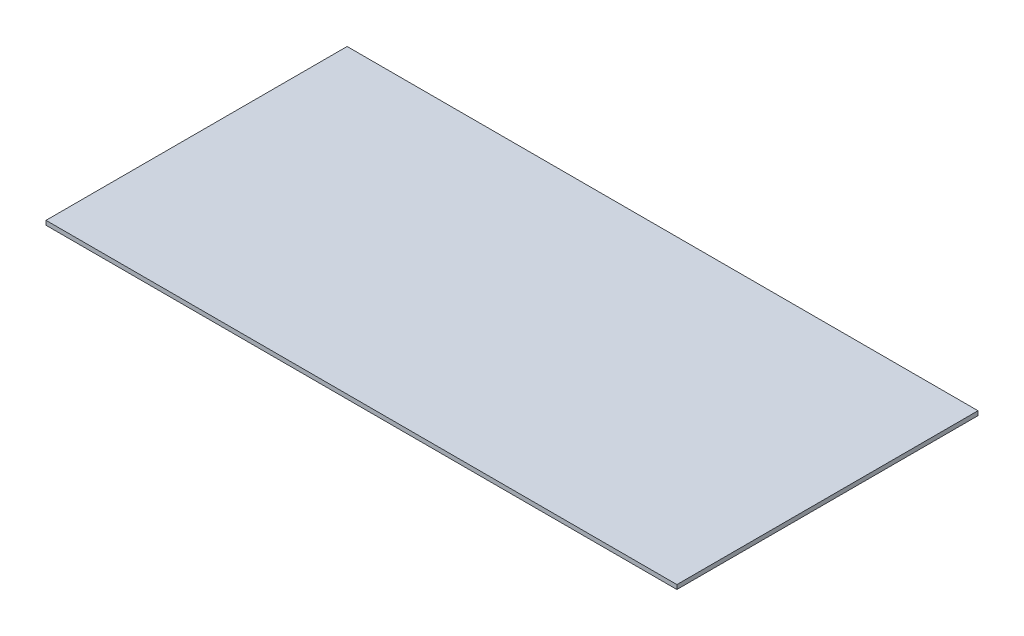
ISO-10303-21;
HEADER;
FILE_DESCRIPTION(('STEP AP214'),'2;1');
FILE_NAME('part.step','',(''),(''),'','','');
FILE_SCHEMA(('AUTOMOTIVE_DESIGN { 1 0 10303 214 1 1 1 1 }'));
ENDSEC;
DATA;
#1=APPLICATION_CONTEXT('core data for automotive mechanical design processes');
#2=APPLICATION_PROTOCOL_DEFINITION('international standard','automotive_design',2000,#1);
#3=PRODUCT_CONTEXT('',#1,'mechanical');
#4=PRODUCT('Part','Part','',(#3));
#5=PRODUCT_RELATED_PRODUCT_CATEGORY('part','',(#4));
#6=PRODUCT_DEFINITION_FORMATION('','',#4);
#7=PRODUCT_DEFINITION_CONTEXT('part definition',#1,'design');
#8=PRODUCT_DEFINITION('design','',#6,#7);
#9=PRODUCT_DEFINITION_SHAPE('','',#8);
#10=(LENGTH_UNIT() NAMED_UNIT(*) SI_UNIT(.MILLI.,.METRE.));
#11=(NAMED_UNIT(*) PLANE_ANGLE_UNIT() SI_UNIT($,.RADIAN.));
#12=(NAMED_UNIT(*) SI_UNIT($,.STERADIAN.) SOLID_ANGLE_UNIT());
#13=UNCERTAINTY_MEASURE_WITH_UNIT(LENGTH_MEASURE(1.E-05),#10,'distance_accuracy_value','');
#14=(GEOMETRIC_REPRESENTATION_CONTEXT(3) GLOBAL_UNCERTAINTY_ASSIGNED_CONTEXT((#13)) GLOBAL_UNIT_ASSIGNED_CONTEXT((#10,
#11,#12)) REPRESENTATION_CONTEXT('',''));
#15=CARTESIAN_POINT('',(0.,0.,0.));
#16=DIRECTION('',(0.,0.,1.));
#17=DIRECTION('',(1.,0.,0.));
#18=AXIS2_PLACEMENT_3D('',#15,#16,#17);
#19=CARTESIAN_POINT('',(0.,6.,0.));
#20=DIRECTION('',(1.,0.,0.));
#21=DIRECTION('',(0.,0.,-1.));
#22=AXIS2_PLACEMENT_3D('',#19,#20,#21);
#23=PLANE('',#22);
#24=DIRECTION('',(0.,0.,1.));
#25=VECTOR('',#24,1.);
#26=CARTESIAN_POINT('',(0.,0.,0.));
#27=LINE('',#26,#25);
#28=CARTESIAN_POINT('',(0.,0.,-420.));
#29=VERTEX_POINT('',#28);
#30=CARTESIAN_POINT('',(0.,0.,0.));
#31=VERTEX_POINT('',#30);
#32=EDGE_CURVE('E96',#29,#31,#27,.T.);
#33=ORIENTED_EDGE('',*,*,#32,.T.);
#34=DIRECTION('',(0.,-1.,0.));
#35=VECTOR('',#34,1.);
#36=CARTESIAN_POINT('',(0.,6.,0.));
#37=LINE('',#36,#35);
#38=CARTESIAN_POINT('',(0.,6.,0.));
#39=VERTEX_POINT('',#38);
#40=EDGE_CURVE('E11',#39,#31,#37,.T.);
#41=ORIENTED_EDGE('',*,*,#40,.F.);
#42=DIRECTION('',(0.,0.,1.));
#43=VECTOR('',#42,1.);
#44=CARTESIAN_POINT('',(0.,6.,0.));
#45=LINE('',#44,#43);
#46=CARTESIAN_POINT('',(0.,6.,-420.));
#47=VERTEX_POINT('',#46);
#48=EDGE_CURVE('E84',#47,#39,#45,.T.);
#49=ORIENTED_EDGE('',*,*,#48,.F.);
#50=DIRECTION('',(0.,-1.,0.));
#51=VECTOR('',#50,1.);
#52=CARTESIAN_POINT('',(0.,6.,-420.));
#53=LINE('',#52,#51);
#54=EDGE_CURVE('E92',#47,#29,#53,.T.);
#55=ORIENTED_EDGE('',*,*,#54,.T.);
#56=EDGE_LOOP('',(#33,#41,#49,#55));
#57=FACE_BOUND('',#56,.T.);
#58=ADVANCED_FACE('F33',(#57),#23,.F.);
#59=CARTESIAN_POINT('',(0.,6.,0.));
#60=DIRECTION('',(0.,0.,-1.));
#61=DIRECTION('',(-1.,0.,0.));
#62=AXIS2_PLACEMENT_3D('',#59,#60,#61);
#63=PLANE('',#62);
#64=DIRECTION('',(1.,0.,0.));
#65=VECTOR('',#64,1.);
#66=CARTESIAN_POINT('',(0.,0.,0.));
#67=LINE('',#66,#65);
#68=CARTESIAN_POINT('',(880.,0.,0.));
#69=VERTEX_POINT('',#68);
#70=EDGE_CURVE('E88',#31,#69,#67,.T.);
#71=ORIENTED_EDGE('',*,*,#70,.T.);
#72=DIRECTION('',(0.,-1.,0.));
#73=VECTOR('',#72,1.);
#74=CARTESIAN_POINT('',(880.,6.,0.));
#75=LINE('',#74,#73);
#76=CARTESIAN_POINT('',(880.,6.,0.));
#77=VERTEX_POINT('',#76);
#78=EDGE_CURVE('E41',#77,#69,#75,.T.);
#79=ORIENTED_EDGE('',*,*,#78,.F.);
#80=DIRECTION('',(1.,0.,0.));
#81=VECTOR('',#80,1.);
#82=CARTESIAN_POINT('',(0.,6.,0.));
#83=LINE('',#82,#81);
#84=EDGE_CURVE('E79',#39,#77,#83,.T.);
#85=ORIENTED_EDGE('',*,*,#84,.F.);
#86=ORIENTED_EDGE('',*,*,#40,.T.);
#87=EDGE_LOOP('',(#71,#79,#85,#86));
#88=FACE_BOUND('',#87,.T.);
#89=ADVANCED_FACE('F87',(#88),#63,.F.);
#90=CARTESIAN_POINT('',(880.,6.,0.));
#91=DIRECTION('',(-1.,0.,0.));
#92=DIRECTION('',(0.,0.,1.));
#93=AXIS2_PLACEMENT_3D('',#90,#91,#92);
#94=PLANE('',#93);
#95=DIRECTION('',(0.,0.,-1.));
#96=VECTOR('',#95,1.);
#97=CARTESIAN_POINT('',(880.,0.,0.));
#98=LINE('',#97,#96);
#99=CARTESIAN_POINT('',(880.,0.,-420.));
#100=VERTEX_POINT('',#99);
#101=EDGE_CURVE('E66',#69,#100,#98,.T.);
#102=ORIENTED_EDGE('',*,*,#101,.T.);
#103=DIRECTION('',(0.,-1.,0.));
#104=VECTOR('',#103,1.);
#105=CARTESIAN_POINT('',(880.,6.,-420.));
#106=LINE('',#105,#104);
#107=CARTESIAN_POINT('',(880.,6.,-420.));
#108=VERTEX_POINT('',#107);
#109=EDGE_CURVE('E89',#108,#100,#106,.T.);
#110=ORIENTED_EDGE('',*,*,#109,.F.);
#111=DIRECTION('',(0.,0.,-1.));
#112=VECTOR('',#111,1.);
#113=CARTESIAN_POINT('',(880.,6.,0.));
#114=LINE('',#113,#112);
#115=EDGE_CURVE('E82',#77,#108,#114,.T.);
#116=ORIENTED_EDGE('',*,*,#115,.F.);
#117=ORIENTED_EDGE('',*,*,#78,.T.);
#118=EDGE_LOOP('',(#102,#110,#116,#117));
#119=FACE_BOUND('',#118,.T.);
#120=ADVANCED_FACE('F90',(#119),#94,.F.);
#121=CARTESIAN_POINT('',(0.,6.,-420.));
#122=DIRECTION('',(0.,0.,1.));
#123=DIRECTION('',(1.,0.,0.));
#124=AXIS2_PLACEMENT_3D('',#121,#122,#123);
#125=PLANE('',#124);
#126=DIRECTION('',(-1.,0.,0.));
#127=VECTOR('',#126,1.);
#128=CARTESIAN_POINT('',(0.,0.,-420.));
#129=LINE('',#128,#127);
#130=EDGE_CURVE('E72',#100,#29,#129,.T.);
#131=ORIENTED_EDGE('',*,*,#130,.T.);
#132=ORIENTED_EDGE('',*,*,#54,.F.);
#133=DIRECTION('',(-1.,0.,0.));
#134=VECTOR('',#133,1.);
#135=CARTESIAN_POINT('',(0.,6.,-420.));
#136=LINE('',#135,#134);
#137=EDGE_CURVE('E49',#108,#47,#136,.T.);
#138=ORIENTED_EDGE('',*,*,#137,.F.);
#139=ORIENTED_EDGE('',*,*,#109,.T.);
#140=EDGE_LOOP('',(#131,#132,#138,#139));
#141=FACE_BOUND('',#140,.T.);
#142=ADVANCED_FACE('F103',(#141),#125,.F.);
#143=CARTESIAN_POINT('',(0.,6.,0.));
#144=DIRECTION('',(0.,-1.,0.));
#145=DIRECTION('',(0.,0.,-1.));
#146=AXIS2_PLACEMENT_3D('',#143,#144,#145);
#147=PLANE('',#146);
#148=ORIENTED_EDGE('',*,*,#48,.T.);
#149=ORIENTED_EDGE('',*,*,#84,.T.);
#150=ORIENTED_EDGE('',*,*,#115,.T.);
#151=ORIENTED_EDGE('',*,*,#137,.T.);
#152=EDGE_LOOP('',(#148,#149,#150,#151));
#153=FACE_BOUND('',#152,.T.);
#154=ADVANCED_FACE('F80',(#153),#147,.F.);
#155=CARTESIAN_POINT('',(0.,0.,0.));
#156=DIRECTION('',(0.,-1.,0.));
#157=DIRECTION('',(0.,0.,-1.));
#158=AXIS2_PLACEMENT_3D('',#155,#156,#157);
#159=PLANE('',#158);
#160=ORIENTED_EDGE('',*,*,#32,.F.);
#161=ORIENTED_EDGE('',*,*,#130,.F.);
#162=ORIENTED_EDGE('',*,*,#101,.F.);
#163=ORIENTED_EDGE('',*,*,#70,.F.);
#164=EDGE_LOOP('',(#160,#161,#162,#163));
#165=FACE_BOUND('',#164,.T.);
#166=ADVANCED_FACE('F106',(#165),#159,.T.);
#167=CLOSED_SHELL('',(#58,#89,#120,#142,#154,#166));
#168=MANIFOLD_SOLID_BREP('B2',#167);
#169=ADVANCED_BREP_SHAPE_REPRESENTATION('',(#18,#168),#14);
#170=SHAPE_DEFINITION_REPRESENTATION(#9,#169);
ENDSEC;
END-ISO-10303-21;
